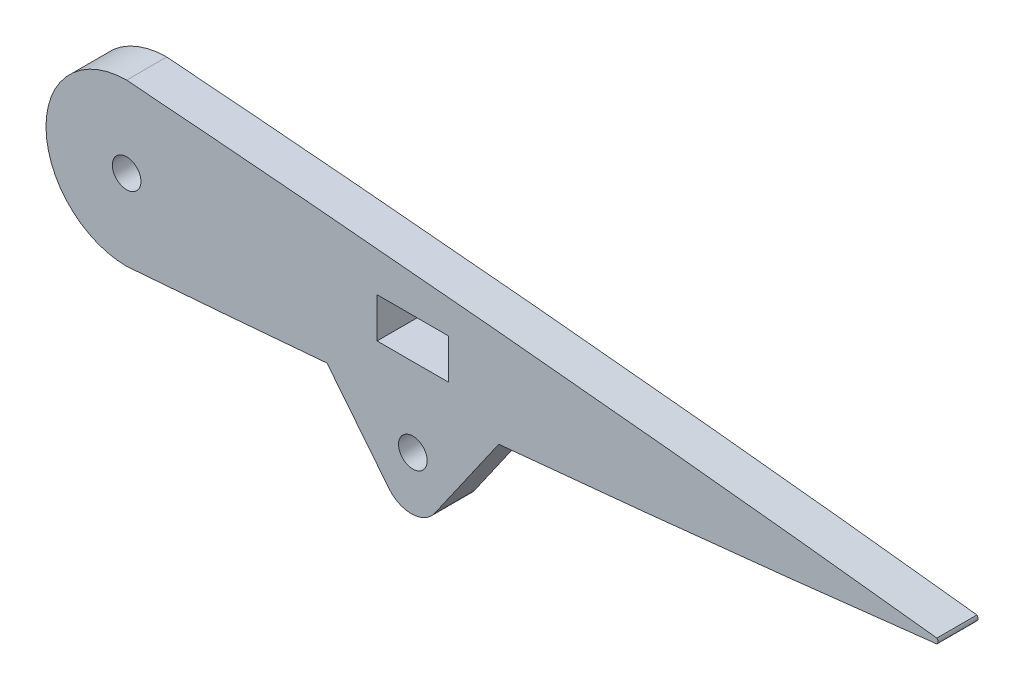
ISO-10303-21;
HEADER;
FILE_DESCRIPTION(('STEP AP214'),'2;1');
FILE_NAME('part.step','',(''),(''),'','','');
FILE_SCHEMA(('AUTOMOTIVE_DESIGN { 1 0 10303 214 1 1 1 1 }'));
ENDSEC;
DATA;
#1=APPLICATION_CONTEXT('core data for automotive mechanical design processes');
#2=APPLICATION_PROTOCOL_DEFINITION('international standard','automotive_design',2000,#1);
#3=PRODUCT_CONTEXT('',#1,'mechanical');
#4=PRODUCT('Part','Part','',(#3));
#5=PRODUCT_RELATED_PRODUCT_CATEGORY('part','',(#4));
#6=PRODUCT_DEFINITION_FORMATION('','',#4);
#7=PRODUCT_DEFINITION_CONTEXT('part definition',#1,'design');
#8=PRODUCT_DEFINITION('design','',#6,#7);
#9=PRODUCT_DEFINITION_SHAPE('','',#8);
#10=(LENGTH_UNIT() NAMED_UNIT(*) SI_UNIT(.MILLI.,.METRE.));
#11=(NAMED_UNIT(*) PLANE_ANGLE_UNIT() SI_UNIT($,.RADIAN.));
#12=(NAMED_UNIT(*) SI_UNIT($,.STERADIAN.) SOLID_ANGLE_UNIT());
#13=UNCERTAINTY_MEASURE_WITH_UNIT(LENGTH_MEASURE(1.E-05),#10,'distance_accuracy_value','');
#14=(GEOMETRIC_REPRESENTATION_CONTEXT(3) GLOBAL_UNCERTAINTY_ASSIGNED_CONTEXT((#13)) GLOBAL_UNIT_ASSIGNED_CONTEXT((#10,
#11,#12)) REPRESENTATION_CONTEXT('',''));
#15=CARTESIAN_POINT('',(0.,0.,0.));
#16=DIRECTION('',(0.,0.,1.));
#17=DIRECTION('',(1.,0.,0.));
#18=AXIS2_PLACEMENT_3D('',#15,#16,#17);
#19=CARTESIAN_POINT('',(169.330721683866,-118.139476491506,1.4));
#20=DIRECTION('',(-0.820122945797254,0.572187341503492,0.));
#21=DIRECTION('',(-0.572187341503492,-0.820122945797254,0.));
#22=AXIS2_PLACEMENT_3D('',#19,#20,#21);
#23=PLANE('',#22);
#24=DIRECTION('',(0.572187341503492,0.820122945797254,0.));
#25=VECTOR('',#24,1.);
#26=CARTESIAN_POINT('',(169.330721683866,-118.139476491506,-1.4));
#27=LINE('',#26,#25);
#28=CARTESIAN_POINT('',(244.914699501068,-9.80405896962212,-1.4));
#29=VERTEX_POINT('',#28);
#30=CARTESIAN_POINT('',(249.382624747265,-3.40012838827625,-1.4));
#31=VERTEX_POINT('',#30);
#32=EDGE_CURVE('E179',#29,#31,#27,.T.);
#33=ORIENTED_EDGE('',*,*,#32,.T.);
#34=DIRECTION('',(0.,0.,-1.));
#35=VECTOR('',#34,1.);
#36=CARTESIAN_POINT('',(249.382624747265,-3.40012838827625,1.4));
#37=LINE('',#36,#35);
#38=CARTESIAN_POINT('',(249.382624747265,-3.40012838827625,1.4));
#39=VERTEX_POINT('',#38);
#40=EDGE_CURVE('E11',#39,#31,#37,.T.);
#41=ORIENTED_EDGE('',*,*,#40,.F.);
#42=DIRECTION('',(0.572187341503492,0.820122945797254,0.));
#43=VECTOR('',#42,1.);
#44=CARTESIAN_POINT('',(169.330721683866,-118.139476491506,1.4));
#45=LINE('',#44,#43);
#46=CARTESIAN_POINT('',(244.914699501068,-9.80405896962212,1.4));
#47=VERTEX_POINT('',#46);
#48=EDGE_CURVE('E257',#47,#39,#45,.T.);
#49=ORIENTED_EDGE('',*,*,#48,.F.);
#50=DIRECTION('',(0.,0.,-1.));
#51=VECTOR('',#50,1.);
#52=CARTESIAN_POINT('',(244.914699501068,-9.80405896962212,1.4));
#53=LINE('',#52,#51);
#54=EDGE_CURVE('E211',#47,#29,#53,.T.);
#55=ORIENTED_EDGE('',*,*,#54,.T.);
#56=EDGE_LOOP('',(#33,#41,#49,#55));
#57=FACE_BOUND('',#56,.T.);
#58=ADVANCED_FACE('F35',(#57),#23,.F.);
#59=CARTESIAN_POINT('',(249.382624747265,-3.40012838827632,1.4));
#60=CARTESIAN_POINT('',(251.158571989076,-3.23227422422827,1.4));
#61=CARTESIAN_POINT('',(254.371192488481,-2.92300016112608,1.4));
#62=CARTESIAN_POINT('',(258.952644661841,-2.46718813767968,1.4));
#63=CARTESIAN_POINT('',(263.04774337821,-2.04785660382374,1.4));
#64=CARTESIAN_POINT('',(266.898988861822,-1.64260730408502,1.4));
#65=CARTESIAN_POINT('',(270.455833183166,-1.25859090465163,1.4));
#66=CARTESIAN_POINT('',(273.651166983566,-0.905304265448741,1.4));
#67=CARTESIAN_POINT('',(276.385426802208,-0.596436481930152,1.4));
#68=CARTESIAN_POINT('',(278.452596210233,-0.358958360841393,1.4));
#69=CARTESIAN_POINT('',(279.592043703671,-0.226075897782657,1.4));
#70=CARTESIAN_POINT('',(280.,-0.1785,1.4));
#71=B_SPLINE_CURVE_WITH_KNOTS('',3,(#59,#60,#61,#62,#63,#64,#65,#66,#67,#68,#69,#70),
.UNSPECIFIED.,.F.,.F.,(4,1,1,1,1,1,1,1,1,4),(0.821480843588143,0.852512114582347,
0.877624445997917,0.901571133904992,0.924121062493777,0.944988816236938,0.963803938777258,
0.980044339265455,0.992855276358985,1.),.UNSPECIFIED.);
#72=DIRECTION('',(0.,0.,-1.));
#73=VECTOR('',#72,1.);
#74=SURFACE_OF_LINEAR_EXTRUSION('',#71,#73);
#75=CARTESIAN_POINT('',(249.382624747265,-3.40012838827632,-1.4));
#76=CARTESIAN_POINT('',(251.158571989076,-3.23227422422827,-1.4));
#77=CARTESIAN_POINT('',(254.371192488481,-2.92300016112608,-1.4));
#78=CARTESIAN_POINT('',(258.952644661841,-2.46718813767968,-1.4));
#79=CARTESIAN_POINT('',(263.04774337821,-2.04785660382374,-1.4));
#80=CARTESIAN_POINT('',(266.898988861822,-1.64260730408502,-1.4));
#81=CARTESIAN_POINT('',(270.455833183166,-1.25859090465163,-1.4));
#82=CARTESIAN_POINT('',(273.651166983566,-0.905304265448741,-1.4));
#83=CARTESIAN_POINT('',(276.385426802208,-0.596436481930152,-1.4));
#84=CARTESIAN_POINT('',(278.452596210233,-0.358958360841393,-1.4));
#85=CARTESIAN_POINT('',(279.592043703671,-0.226075897782657,-1.4));
#86=CARTESIAN_POINT('',(280.,-0.1785,-1.4));
#87=B_SPLINE_CURVE_WITH_KNOTS('',3,(#75,#76,#77,#78,#79,#80,#81,#82,#83,#84,#85,#86),
.UNSPECIFIED.,.F.,.F.,(4,1,1,1,1,1,1,1,1,4),(0.821480843588143,0.852512114582347,
0.877624445997917,0.901571133904992,0.924121062493777,0.944988816236938,0.963803938777258,
0.980044339265455,0.992855276358985,1.),.UNSPECIFIED.);
#88=CARTESIAN_POINT('',(280.,-0.1785,-1.4));
#89=VERTEX_POINT('',#88);
#90=EDGE_CURVE('E182',#31,#89,#87,.T.);
#91=ORIENTED_EDGE('',*,*,#90,.T.);
#92=DIRECTION('',(0.,0.,-1.));
#93=VECTOR('',#92,1.);
#94=CARTESIAN_POINT('',(280.,-0.1785,1.4));
#95=LINE('',#94,#93);
#96=CARTESIAN_POINT('',(280.,-0.1785,1.4));
#97=VERTEX_POINT('',#96);
#98=EDGE_CURVE('E45',#97,#89,#95,.T.);
#99=ORIENTED_EDGE('',*,*,#98,.F.);
#100=EDGE_CURVE('E259',#39,#97,#71,.T.);
#101=ORIENTED_EDGE('',*,*,#100,.F.);
#102=ORIENTED_EDGE('',*,*,#40,.T.);
#103=EDGE_LOOP('',(#91,#99,#101,#102));
#104=FACE_BOUND('',#103,.T.);
#105=ADVANCED_FACE('F270',(#104),#74,.F.);
#106=CARTESIAN_POINT('',(279.8215,0.,1.4));
#107=DIRECTION('',(0.,0.,-1.));
#108=DIRECTION('',(-1.,0.,0.));
#109=AXIS2_PLACEMENT_3D('',#106,#107,#108);
#110=CYLINDRICAL_SURFACE('',#109,0.252437120883675);
#111=CARTESIAN_POINT('',(279.8215,0.,-1.4));
#112=DIRECTION('',(0.,0.,1.));
#113=DIRECTION('',(1.,0.,0.));
#114=AXIS2_PLACEMENT_3D('',#111,#112,#113);
#115=CIRCLE('',#114,0.252437120883675);
#116=CARTESIAN_POINT('',(280.,0.1785,-1.4));
#117=VERTEX_POINT('',#116);
#118=EDGE_CURVE('E187',#117,#89,#115,.F.);
#119=ORIENTED_EDGE('',*,*,#118,.F.);
#120=DIRECTION('',(0.,0.,-1.));
#121=VECTOR('',#120,1.);
#122=CARTESIAN_POINT('',(280.,0.1785,1.4));
#123=LINE('',#122,#121);
#124=CARTESIAN_POINT('',(280.,0.1785,1.4));
#125=VERTEX_POINT('',#124);
#126=EDGE_CURVE('E218',#125,#117,#123,.T.);
#127=ORIENTED_EDGE('',*,*,#126,.F.);
#128=CARTESIAN_POINT('',(279.8215,0.,1.4));
#129=DIRECTION('',(0.,0.,1.));
#130=DIRECTION('',(1.,0.,0.));
#131=AXIS2_PLACEMENT_3D('',#128,#129,#130);
#132=CIRCLE('',#131,0.252437120883675);
#133=EDGE_CURVE('E264',#125,#97,#132,.F.);
#134=ORIENTED_EDGE('',*,*,#133,.T.);
#135=ORIENTED_EDGE('',*,*,#98,.T.);
#136=EDGE_LOOP('',(#119,#127,#134,#135));
#137=FACE_BOUND('',#136,.T.);
#138=ADVANCED_FACE('F274',(#137),#110,.T.);
#139=CARTESIAN_POINT('',(280.,0.1785,1.4));
#140=CARTESIAN_POINT('',(279.592043703671,0.226075897783467,1.4));
#141=CARTESIAN_POINT('',(278.452596210234,0.358958360844463,1.4));
#142=CARTESIAN_POINT('',(276.385426802208,0.596436481937331,1.4));
#143=CARTESIAN_POINT('',(273.651166983567,0.905304265461348,1.4));
#144=CARTESIAN_POINT('',(270.455833183168,1.25859090467058,1.4));
#145=CARTESIAN_POINT('',(266.898988861825,1.64260730411104,1.4));
#146=CARTESIAN_POINT('',(263.047743378214,2.04785660385741,1.4));
#147=CARTESIAN_POINT('',(258.952644661846,2.46718813772148,1.4));
#148=CARTESIAN_POINT('',(253.11611192075,3.04786904369115,1.4));
#149=CARTESIAN_POINT('',(247.071089235748,3.62220530992837,1.4));
#150=CARTESIAN_POINT('',(240.854179313273,4.18491264898859,1.4));
#151=CARTESIAN_POINT('',(236.038226964104,4.60581174883637,1.4));
#152=CARTESIAN_POINT('',(231.150377302514,5.0173511026198,1.4));
#153=CARTESIAN_POINT('',(226.209311113549,5.41695826474113,1.4));
#154=CARTESIAN_POINT('',(221.232257466585,5.802244474926,1.4));
#155=CARTESIAN_POINT('',(216.235178286272,6.17086457697306,1.4));
#156=CARTESIAN_POINT('',(211.232977593233,6.52047434958791,1.4));
#157=CARTESIAN_POINT('',(206.239642946259,6.84887299963153,1.4));
#158=CARTESIAN_POINT('',(201.268368916985,7.15382688632495,1.4));
#159=CARTESIAN_POINT('',(196.331634567492,7.43310533690328,1.4));
#160=CARTESIAN_POINT('',(191.441311474098,7.68460443906704,1.4));
#161=CARTESIAN_POINT('',(186.608700126931,7.90621829286941,1.4));
#162=CARTESIAN_POINT('',(181.844626933159,8.09595849303594,1.4));
#163=CARTESIAN_POINT('',(177.159453511195,8.25195768192942,1.4));
#164=CARTESIAN_POINT('',(172.563150271755,8.37248656398387,1.4));
#165=CARTESIAN_POINT('',(168.065295924147,8.45595366245417,1.4));
#166=CARTESIAN_POINT('',(163.675147454163,8.5010026998616,1.4));
#167=CARTESIAN_POINT('',(159.401643403725,8.50652296727326,1.4));
#168=CARTESIAN_POINT('',(155.253439755899,8.47152880790102,1.4));
#169=CARTESIAN_POINT('',(151.238917925322,8.39550607585732,1.4));
#170=CARTESIAN_POINT('',(147.366223919106,8.27798597685019,1.4));
#171=CARTESIAN_POINT('',(143.643266298458,8.11897556141504,1.4));
#172=CARTESIAN_POINT('',(140.077743555427,7.91867894287145,1.4));
#173=CARTESIAN_POINT('',(136.677139412155,7.67760454203032,1.4));
#174=CARTESIAN_POINT('',(133.44876289533,7.39648056861162,1.4));
#175=CARTESIAN_POINT('',(130.399721685833,7.07642431038863,1.4));
#176=CARTESIAN_POINT('',(127.536961088608,6.71865034112428,1.4));
#177=CARTESIAN_POINT('',(124.867245825052,6.32466607739586,1.4));
#178=CARTESIAN_POINT('',(122.397158973637,5.89612056643678,1.4));
#179=CARTESIAN_POINT('',(120.133109351335,5.43479747619412,1.4));
#180=CARTESIAN_POINT('',(118.081312132678,4.94256764101073,1.4));
#181=CARTESIAN_POINT('',(116.247665797811,4.42139238611828,1.4));
#182=CARTESIAN_POINT('',(114.637939719778,3.87306046577258,1.4));
#183=CARTESIAN_POINT('',(113.256788366372,3.29930923783808,1.4));
#184=CARTESIAN_POINT('',(112.109835923497,2.70130638754162,1.4));
#185=CARTESIAN_POINT('',(111.196336340545,2.07855523302877,1.4));
#186=CARTESIAN_POINT('',(110.530223641577,1.42706975809109,1.4));
#187=CARTESIAN_POINT('',(110.085538217979,0.734230220465984,1.4));
#188=CARTESIAN_POINT('',(110.027578175867,0.236721440142773,1.4));
#189=CARTESIAN_POINT('',(110.,0.,1.4));
#190=B_SPLINE_CURVE_WITH_KNOTS('',3,(#139,#140,#141,#142,#143,#144,#145,#146,#147,#148,#149,
#150,#151,#152,#153,#154,#155,#156,#157,#158,#159,#160,#161,#162,#163,#164,#165,#166,#167,#168,
#169,#170,#171,#172,#173,#174,#175,#176,#177,#178,#179,#180,#181,#182,#183,#184,#185,#186,#187,
#188,#189),.UNSPECIFIED.,.F.,.F.,(4,1,1,1,1,1,1,1,1,1,1,1,1,1,1,1,1,1,1,1,1,1,1,1,1,1,1,1,1,1,1,
1,1,1,1,1,1,1,1,1,1,1,1,1,1,1,1,1,4),(0.,0.00714472364101537,0.0199556607345446,
0.0361960612227423,0.0550111837630616,0.0758789375062231,0.0984288660950085,0.122375554002083,
0.147487885417653,0.200459747132314,0.228005170188377,0.256076453638138,0.284555151070125,
0.31333276259982,0.342309553949656,0.371392651251454,0.400495752426115,0.429537687145242,
0.458441905920554,0.487136113386761,0.515551917136779,0.543623846405843,0.571289984327897,
0.598490809568145,0.625169613225281,0.651272029103837,0.676746157949116,0.701541790883913,
0.725611016556625,0.74890783507394,0.771387785068823,0.793008138575143,0.813728032856974,
0.833507815357633,0.852309696093785,0.870097310144046,0.886835918069106,0.902492781713446,
0.917037139140432,0.930441053860646,0.942679762162792,0.953733567025024,0.963589785484808,
0.97224701929817,0.979722225388436,0.986065145275041,0.991385258303778,0.995900988803729,1.),.UNSPECIFIED.);
#191=DIRECTION('',(0.,0.,-1.));
#192=VECTOR('',#191,1.);
#193=SURFACE_OF_LINEAR_EXTRUSION('',#190,#192);
#194=CARTESIAN_POINT('',(280.,0.1785,-1.4));
#195=CARTESIAN_POINT('',(279.592043703671,0.226075897783467,-1.4));
#196=CARTESIAN_POINT('',(278.452596210234,0.358958360844463,-1.4));
#197=CARTESIAN_POINT('',(276.385426802208,0.596436481937331,-1.4));
#198=CARTESIAN_POINT('',(273.651166983567,0.905304265461348,-1.4));
#199=CARTESIAN_POINT('',(270.455833183168,1.25859090467058,-1.4));
#200=CARTESIAN_POINT('',(266.898988861825,1.64260730411104,-1.4));
#201=CARTESIAN_POINT('',(263.047743378214,2.04785660385741,-1.4));
#202=CARTESIAN_POINT('',(258.952644661846,2.46718813772148,-1.4));
#203=CARTESIAN_POINT('',(253.11611192075,3.04786904369115,-1.4));
#204=CARTESIAN_POINT('',(247.071089235748,3.62220530992837,-1.4));
#205=CARTESIAN_POINT('',(240.854179313273,4.18491264898859,-1.4));
#206=CARTESIAN_POINT('',(236.038226964104,4.60581174883637,-1.4));
#207=CARTESIAN_POINT('',(231.150377302514,5.0173511026198,-1.4));
#208=CARTESIAN_POINT('',(226.209311113549,5.41695826474113,-1.4));
#209=CARTESIAN_POINT('',(221.232257466585,5.802244474926,-1.4));
#210=CARTESIAN_POINT('',(216.235178286272,6.17086457697306,-1.4));
#211=CARTESIAN_POINT('',(211.232977593233,6.52047434958791,-1.4));
#212=CARTESIAN_POINT('',(206.239642946259,6.84887299963153,-1.4));
#213=CARTESIAN_POINT('',(201.268368916985,7.15382688632495,-1.4));
#214=CARTESIAN_POINT('',(196.331634567492,7.43310533690328,-1.4));
#215=CARTESIAN_POINT('',(191.441311474098,7.68460443906704,-1.4));
#216=CARTESIAN_POINT('',(186.608700126931,7.90621829286941,-1.4));
#217=CARTESIAN_POINT('',(181.844626933159,8.09595849303594,-1.4));
#218=CARTESIAN_POINT('',(177.159453511195,8.25195768192942,-1.4));
#219=CARTESIAN_POINT('',(172.563150271755,8.37248656398387,-1.4));
#220=CARTESIAN_POINT('',(168.065295924147,8.45595366245417,-1.4));
#221=CARTESIAN_POINT('',(163.675147454163,8.5010026998616,-1.4));
#222=CARTESIAN_POINT('',(159.401643403725,8.50652296727326,-1.4));
#223=CARTESIAN_POINT('',(155.253439755899,8.47152880790102,-1.4));
#224=CARTESIAN_POINT('',(151.238917925322,8.39550607585732,-1.4));
#225=CARTESIAN_POINT('',(147.366223919106,8.27798597685019,-1.4));
#226=CARTESIAN_POINT('',(143.643266298458,8.11897556141504,-1.4));
#227=CARTESIAN_POINT('',(140.077743555427,7.91867894287145,-1.4));
#228=CARTESIAN_POINT('',(136.677139412155,7.67760454203032,-1.4));
#229=CARTESIAN_POINT('',(133.44876289533,7.39648056861162,-1.4));
#230=CARTESIAN_POINT('',(130.399721685833,7.07642431038863,-1.4));
#231=CARTESIAN_POINT('',(127.536961088608,6.71865034112428,-1.4));
#232=CARTESIAN_POINT('',(124.867245825052,6.32466607739586,-1.4));
#233=CARTESIAN_POINT('',(122.397158973637,5.89612056643678,-1.4));
#234=CARTESIAN_POINT('',(120.133109351335,5.43479747619412,-1.4));
#235=CARTESIAN_POINT('',(118.081312132678,4.94256764101073,-1.4));
#236=CARTESIAN_POINT('',(116.247665797811,4.42139238611828,-1.4));
#237=CARTESIAN_POINT('',(114.637939719778,3.87306046577258,-1.4));
#238=CARTESIAN_POINT('',(113.256788366372,3.29930923783808,-1.4));
#239=CARTESIAN_POINT('',(112.109835923497,2.70130638754162,-1.4));
#240=CARTESIAN_POINT('',(111.196336340545,2.07855523302877,-1.4));
#241=CARTESIAN_POINT('',(110.530223641577,1.42706975809109,-1.4));
#242=CARTESIAN_POINT('',(110.085538217979,0.734230220465984,-1.4));
#243=CARTESIAN_POINT('',(110.027578175867,0.236721440142773,-1.4));
#244=CARTESIAN_POINT('',(110.,0.,-1.4));
#245=B_SPLINE_CURVE_WITH_KNOTS('',3,(#194,#195,#196,#197,#198,#199,#200,#201,#202,#203,#204,
#205,#206,#207,#208,#209,#210,#211,#212,#213,#214,#215,#216,#217,#218,#219,#220,#221,#222,#223,
#224,#225,#226,#227,#228,#229,#230,#231,#232,#233,#234,#235,#236,#237,#238,#239,#240,#241,#242,
#243,#244),.UNSPECIFIED.,.F.,.F.,(4,1,1,1,1,1,1,1,1,1,1,1,1,1,1,1,1,1,1,1,1,1,1,1,1,1,1,1,1,1,1,
1,1,1,1,1,1,1,1,1,1,1,1,1,1,1,1,1,4),(0.,0.00714472364101537,0.0199556607345446,
0.0361960612227423,0.0550111837630616,0.0758789375062231,0.0984288660950085,0.122375554002083,
0.147487885417653,0.200459747132314,0.228005170188377,0.256076453638138,0.284555151070125,
0.31333276259982,0.342309553949656,0.371392651251454,0.400495752426115,0.429537687145242,
0.458441905920554,0.487136113386761,0.515551917136779,0.543623846405843,0.571289984327897,
0.598490809568145,0.625169613225281,0.651272029103837,0.676746157949116,0.701541790883913,
0.725611016556625,0.74890783507394,0.771387785068823,0.793008138575143,0.813728032856974,
0.833507815357633,0.852309696093785,0.870097310144046,0.886835918069106,0.902492781713446,
0.917037139140432,0.930441053860646,0.942679762162792,0.953733567025024,0.963589785484808,
0.97224701929817,0.979722225388436,0.986065145275041,0.991385258303778,0.995900988803729,1.),.UNSPECIFIED.);
#246=CARTESIAN_POINT('',(223.382624747256,5.63499062833055,-1.4));
#247=VERTEX_POINT('',#246);
#248=EDGE_CURVE('E193',#117,#247,#245,.T.);
#249=ORIENTED_EDGE('',*,*,#248,.T.);
#250=DIRECTION('',(0.,0.,-1.));
#251=VECTOR('',#250,1.);
#252=CARTESIAN_POINT('',(223.382624747256,5.63499062833055,1.4));
#253=LINE('',#252,#251);
#254=CARTESIAN_POINT('',(223.382624747256,5.63499062833055,1.4));
#255=VERTEX_POINT('',#254);
#256=EDGE_CURVE('E215',#255,#247,#253,.T.);
#257=ORIENTED_EDGE('',*,*,#256,.F.);
#258=EDGE_CURVE('E313',#125,#255,#190,.T.);
#259=ORIENTED_EDGE('',*,*,#258,.F.);
#260=ORIENTED_EDGE('',*,*,#126,.T.);
#261=EDGE_LOOP('',(#249,#257,#259,#260));
#262=FACE_BOUND('',#261,.T.);
#263=ADVANCED_FACE('F309',(#262),#193,.F.);
#264=CARTESIAN_POINT('',(223.382624747265,3.73832909072992E-12,1.4));
#265=DIRECTION('',(0.,0.,-1.));
#266=DIRECTION('',(-1.,0.,0.));
#267=AXIS2_PLACEMENT_3D('',#264,#265,#266);
#268=CYLINDRICAL_SURFACE('',#267,5.63499062832681);
#269=CARTESIAN_POINT('',(223.382624747265,3.73832909072992E-12,-1.4));
#270=DIRECTION('',(0.,0.,1.));
#271=DIRECTION('',(1.,0.,0.));
#272=AXIS2_PLACEMENT_3D('',#269,#270,#271);
#273=CIRCLE('',#272,5.63499062832681);
#274=CARTESIAN_POINT('',(223.382624747256,-5.63499062832307,-1.4));
#275=VERTEX_POINT('',#274);
#276=EDGE_CURVE('E197',#247,#275,#273,.T.);
#277=ORIENTED_EDGE('',*,*,#276,.T.);
#278=DIRECTION('',(0.,0.,-1.));
#279=VECTOR('',#278,1.);
#280=CARTESIAN_POINT('',(223.382624747256,-5.63499062832307,1.4));
#281=LINE('',#280,#279);
#282=CARTESIAN_POINT('',(223.382624747256,-5.63499062832307,1.4));
#283=VERTEX_POINT('',#282);
#284=EDGE_CURVE('E150',#283,#275,#281,.T.);
#285=ORIENTED_EDGE('',*,*,#284,.F.);
#286=CARTESIAN_POINT('',(223.382624747265,3.73832909072992E-12,1.4));
#287=DIRECTION('',(0.,0.,1.));
#288=DIRECTION('',(1.,0.,0.));
#289=AXIS2_PLACEMENT_3D('',#286,#287,#288);
#290=CIRCLE('',#289,5.63499062832681);
#291=EDGE_CURVE('E141',#255,#283,#290,.T.);
#292=ORIENTED_EDGE('',*,*,#291,.F.);
#293=ORIENTED_EDGE('',*,*,#256,.T.);
#294=EDGE_LOOP('',(#277,#285,#292,#293));
#295=FACE_BOUND('',#294,.T.);
#296=ADVANCED_FACE('F303',(#295),#268,.T.);
#297=CARTESIAN_POINT('',(110.,0.,1.4));
#298=CARTESIAN_POINT('',(110.0275781759,-0.23672144013897,1.4));
#299=CARTESIAN_POINT('',(110.08553821808,-0.734230220454186,1.4));
#300=CARTESIAN_POINT('',(110.530223641774,-1.42706975801802,1.4));
#301=CARTESIAN_POINT('',(111.196336340831,-2.07855523286391,1.4));
#302=CARTESIAN_POINT('',(112.109835923869,-2.70130638725085,1.4));
#303=CARTESIAN_POINT('',(113.256788366826,-3.29930923738926,1.4));
#304=CARTESIAN_POINT('',(114.637939720312,-3.87306046513341,1.4));
#305=CARTESIAN_POINT('',(116.24766579842,-4.42139238525728,1.4));
#306=CARTESIAN_POINT('',(118.081312133359,-4.94256763989703,1.4));
#307=CARTESIAN_POINT('',(120.133109352084,-5.43479747479766,1.4));
#308=CARTESIAN_POINT('',(122.39715897445,-5.8961205647283,1.4));
#309=CARTESIAN_POINT('',(124.867245825924,-6.32466607534698,1.4));
#310=CARTESIAN_POINT('',(127.536961089533,-6.71865033870748,1.4));
#311=CARTESIAN_POINT('',(130.399721686808,-7.07642430757731,1.4));
#312=CARTESIAN_POINT('',(133.44876289635,-7.3964805653801,1.4));
#313=CARTESIAN_POINT('',(136.677139413213,-7.6776045383539,1.4));
#314=CARTESIAN_POINT('',(140.077743556518,-7.91867893872639,1.4));
#315=CARTESIAN_POINT('',(143.643266299577,-8.1189755567786,1.4));
#316=CARTESIAN_POINT('',(147.366223920246,-8.27798597170068,1.4));
#317=CARTESIAN_POINT('',(151.238917926479,-8.39550607017411,1.4));
#318=CARTESIAN_POINT('',(155.253439757066,-8.47152880166456,1.4));
#319=CARTESIAN_POINT('',(159.401643404897,-8.50652296046512,1.4));
#320=CARTESIAN_POINT('',(163.675147455335,-8.50100269246453,1.4));
#321=CARTESIAN_POINT('',(168.065295925312,-8.45595365445208,1.4));
#322=CARTESIAN_POINT('',(172.563150272909,-8.37248655536192,1.4));
#323=CARTESIAN_POINT('',(177.159453512332,-8.25195767267405,1.4));
#324=CARTESIAN_POINT('',(181.844626934275,-8.0959584831349,1.4));
#325=CARTESIAN_POINT('',(186.60870012802,-7.90621828231182,1.4));
#326=CARTESIAN_POINT('',(191.441311475157,-7.68460442784347,1.4));
#327=CARTESIAN_POINT('',(196.331634568517,-7.43310532500576,1.4));
#328=CARTESIAN_POINT('',(201.268368917971,-7.15382687374709,1.4));
#329=CARTESIAN_POINT('',(206.239642947203,-6.84887298636857,1.4));
#330=CARTESIAN_POINT('',(211.232977594131,-6.52047433563681,1.4));
#331=CARTESIAN_POINT('',(216.235178287122,-6.17086456233259,1.4));
#332=CARTESIAN_POINT('',(221.232257467384,-5.80224445959688,1.4));
#333=CARTESIAN_POINT('',(226.209311114295,-5.41695824872611,1.4));
#334=CARTESIAN_POINT('',(231.150377303206,-5.01735108592385,1.4));
#335=CARTESIAN_POINT('',(234.870714804015,-4.70411205455705,1.4));
#336=CARTESIAN_POINT('',(236.942213239561,-4.52545946281774,1.4));
#337=CARTESIAN_POINT('',(237.382624747265,-4.48728584819188,1.4));
#338=B_SPLINE_CURVE_WITH_KNOTS('',3,(#297,#298,#299,#300,#301,#302,#303,#304,#305,#306,#307,
#308,#309,#310,#311,#312,#313,#314,#315,#316,#317,#318,#319,#320,#321,#322,#323,#324,#325,#326,
#327,#328,#329,#330,#331,#332,#333,#334,#335,#336,#337),.UNSPECIFIED.,.F.,.F.,(4,1,1,1,1,1,1,1,
1,1,1,1,1,1,1,1,1,1,1,1,1,1,1,1,1,1,1,1,1,1,1,1,1,1,1,1,1,1,4),(0.,0.00409901119627066,
0.00861474169622249,0.013934854724959,0.0202777746115639,0.0277529807018305,0.0364102145151919,
0.0462664329749759,0.057320237837208,0.0695589461393541,0.0829628608595683,0.0975072182865541,
0.113164081930894,0.129902689855954,0.147690303906216,0.166492184642367,0.186271967143026,
0.206991861424858,0.228612214931177,0.25109216492606,0.274388983443375,0.298458209116087,
0.323253842050884,0.348727970896163,0.374830386774719,0.401509190431855,0.428710015672103,
0.456376153594157,0.484448082863221,0.512863886613239,0.541558094079446,0.570462312854758,
0.599504247573885,0.628607348748546,0.657690446050344,0.68666723740018,0.715444848929875,
0.743923546361862,0.751613474270005),.UNSPECIFIED.);
#339=DIRECTION('',(0.,0.,-1.));
#340=VECTOR('',#339,1.);
#341=SURFACE_OF_LINEAR_EXTRUSION('',#338,#340);
#342=CARTESIAN_POINT('',(110.,0.,-1.4));
#343=CARTESIAN_POINT('',(110.0275781759,-0.23672144013897,-1.4));
#344=CARTESIAN_POINT('',(110.08553821808,-0.734230220454186,-1.4));
#345=CARTESIAN_POINT('',(110.530223641774,-1.42706975801802,-1.4));
#346=CARTESIAN_POINT('',(111.196336340831,-2.07855523286391,-1.4));
#347=CARTESIAN_POINT('',(112.109835923869,-2.70130638725085,-1.4));
#348=CARTESIAN_POINT('',(113.256788366826,-3.29930923738926,-1.4));
#349=CARTESIAN_POINT('',(114.637939720312,-3.87306046513341,-1.4));
#350=CARTESIAN_POINT('',(116.24766579842,-4.42139238525728,-1.4));
#351=CARTESIAN_POINT('',(118.081312133359,-4.94256763989703,-1.4));
#352=CARTESIAN_POINT('',(120.133109352084,-5.43479747479766,-1.4));
#353=CARTESIAN_POINT('',(122.39715897445,-5.8961205647283,-1.4));
#354=CARTESIAN_POINT('',(124.867245825924,-6.32466607534698,-1.4));
#355=CARTESIAN_POINT('',(127.536961089533,-6.71865033870748,-1.4));
#356=CARTESIAN_POINT('',(130.399721686808,-7.07642430757731,-1.4));
#357=CARTESIAN_POINT('',(133.44876289635,-7.3964805653801,-1.4));
#358=CARTESIAN_POINT('',(136.677139413213,-7.6776045383539,-1.4));
#359=CARTESIAN_POINT('',(140.077743556518,-7.91867893872639,-1.4));
#360=CARTESIAN_POINT('',(143.643266299577,-8.1189755567786,-1.4));
#361=CARTESIAN_POINT('',(147.366223920246,-8.27798597170068,-1.4));
#362=CARTESIAN_POINT('',(151.238917926479,-8.39550607017411,-1.4));
#363=CARTESIAN_POINT('',(155.253439757066,-8.47152880166456,-1.4));
#364=CARTESIAN_POINT('',(159.401643404897,-8.50652296046512,-1.4));
#365=CARTESIAN_POINT('',(163.675147455335,-8.50100269246453,-1.4));
#366=CARTESIAN_POINT('',(168.065295925312,-8.45595365445208,-1.4));
#367=CARTESIAN_POINT('',(172.563150272909,-8.37248655536192,-1.4));
#368=CARTESIAN_POINT('',(177.159453512332,-8.25195767267405,-1.4));
#369=CARTESIAN_POINT('',(181.844626934275,-8.0959584831349,-1.4));
#370=CARTESIAN_POINT('',(186.60870012802,-7.90621828231182,-1.4));
#371=CARTESIAN_POINT('',(191.441311475157,-7.68460442784347,-1.4));
#372=CARTESIAN_POINT('',(196.331634568517,-7.43310532500576,-1.4));
#373=CARTESIAN_POINT('',(201.268368917971,-7.15382687374709,-1.4));
#374=CARTESIAN_POINT('',(206.239642947203,-6.84887298636857,-1.4));
#375=CARTESIAN_POINT('',(211.232977594131,-6.52047433563681,-1.4));
#376=CARTESIAN_POINT('',(216.235178287122,-6.17086456233259,-1.4));
#377=CARTESIAN_POINT('',(221.232257467384,-5.80224445959688,-1.4));
#378=CARTESIAN_POINT('',(226.209311114295,-5.41695824872611,-1.4));
#379=CARTESIAN_POINT('',(231.150377303206,-5.01735108592385,-1.4));
#380=CARTESIAN_POINT('',(234.870714804015,-4.70411205455705,-1.4));
#381=CARTESIAN_POINT('',(236.942213239561,-4.52545946281774,-1.4));
#382=CARTESIAN_POINT('',(237.382624747265,-4.48728584819188,-1.4));
#383=B_SPLINE_CURVE_WITH_KNOTS('',3,(#342,#343,#344,#345,#346,#347,#348,#349,#350,#351,#352,
#353,#354,#355,#356,#357,#358,#359,#360,#361,#362,#363,#364,#365,#366,#367,#368,#369,#370,#371,
#372,#373,#374,#375,#376,#377,#378,#379,#380,#381,#382),.UNSPECIFIED.,.F.,.F.,(4,1,1,1,1,1,1,1,
1,1,1,1,1,1,1,1,1,1,1,1,1,1,1,1,1,1,1,1,1,1,1,1,1,1,1,1,1,1,4),(0.,0.00409901119627066,
0.00861474169622249,0.013934854724959,0.0202777746115639,0.0277529807018305,0.0364102145151919,
0.0462664329749759,0.057320237837208,0.0695589461393541,0.0829628608595683,0.0975072182865541,
0.113164081930894,0.129902689855954,0.147690303906216,0.166492184642367,0.186271967143026,
0.206991861424858,0.228612214931177,0.25109216492606,0.274388983443375,0.298458209116087,
0.323253842050884,0.348727970896163,0.374830386774719,0.401509190431855,0.428710015672103,
0.456376153594157,0.484448082863221,0.512863886613239,0.541558094079446,0.570462312854758,
0.599504247573885,0.628607348748546,0.657690446050344,0.68666723740018,0.715444848929875,
0.743923546361862,0.751613474270005),.UNSPECIFIED.);
#384=CARTESIAN_POINT('',(237.382624747265,-4.48728584819186,-1.4));
#385=VERTEX_POINT('',#384);
#386=EDGE_CURVE('E149',#275,#385,#383,.T.);
#387=ORIENTED_EDGE('',*,*,#386,.T.);
#388=DIRECTION('',(0.,0.,-1.));
#389=VECTOR('',#388,1.);
#390=CARTESIAN_POINT('',(237.382624747265,-4.48728584819186,1.4));
#391=LINE('',#390,#389);
#392=CARTESIAN_POINT('',(237.382624747265,-4.48728584819186,1.4));
#393=VERTEX_POINT('',#392);
#394=EDGE_CURVE('E146',#393,#385,#391,.T.);
#395=ORIENTED_EDGE('',*,*,#394,.F.);
#396=EDGE_CURVE('E135',#283,#393,#338,.T.);
#397=ORIENTED_EDGE('',*,*,#396,.F.);
#398=ORIENTED_EDGE('',*,*,#284,.T.);
#399=EDGE_LOOP('',(#387,#395,#397,#398));
#400=FACE_BOUND('',#399,.T.);
#401=ADVANCED_FACE('F147',(#400),#341,.F.);
#402=CARTESIAN_POINT('',(142.748678802525,114.005678308555,1.4));
#403=DIRECTION('',(0.781384592666943,0.62404977232807,0.));
#404=DIRECTION('',(-0.62404977232807,0.781384592666943,0.));
#405=AXIS2_PLACEMENT_3D('',#402,#403,#404);
#406=PLANE('',#405);
#407=DIRECTION('',(0.62404977232807,-0.781384592666943,0.));
#408=VECTOR('',#407,1.);
#409=CARTESIAN_POINT('',(142.748678802525,114.005678308555,-1.4));
#410=LINE('',#409,#408);
#411=CARTESIAN_POINT('',(241.711684424139,-9.90778383127126,-1.4));
#412=VERTEX_POINT('',#411);
#413=EDGE_CURVE('E95',#385,#412,#410,.T.);
#414=ORIENTED_EDGE('',*,*,#413,.T.);
#415=DIRECTION('',(0.,0.,-1.));
#416=VECTOR('',#415,1.);
#417=CARTESIAN_POINT('',(241.711684424139,-9.90778383127126,1.4));
#418=LINE('',#417,#416);
#419=CARTESIAN_POINT('',(241.711684424139,-9.90778383127126,1.4));
#420=VERTEX_POINT('',#419);
#421=EDGE_CURVE('E151',#420,#412,#418,.T.);
#422=ORIENTED_EDGE('',*,*,#421,.F.);
#423=DIRECTION('',(0.62404977232807,-0.781384592666943,0.));
#424=VECTOR('',#423,1.);
#425=CARTESIAN_POINT('',(142.748678802525,114.005678308555,1.4));
#426=LINE('',#425,#424);
#427=EDGE_CURVE('E139',#393,#420,#426,.T.);
#428=ORIENTED_EDGE('',*,*,#427,.F.);
#429=ORIENTED_EDGE('',*,*,#394,.T.);
#430=EDGE_LOOP('',(#414,#422,#428,#429));
#431=FACE_BOUND('',#430,.T.);
#432=ADVANCED_FACE('F153',(#431),#406,.F.);
#433=CARTESIAN_POINT('',(245.882624747265,0.,1.4));
#434=DIRECTION('',(-1.,0.,0.));
#435=DIRECTION('',(0.,0.,1.));
#436=AXIS2_PLACEMENT_3D('',#433,#434,#435);
#437=PLANE('',#436);
#438=DIRECTION('',(0.,1.,0.));
#439=VECTOR('',#438,1.);
#440=CARTESIAN_POINT('',(245.882624747265,0.,-1.4));
#441=LINE('',#440,#439);
#442=CARTESIAN_POINT('',(245.882624747265,-1.4,-1.4));
#443=VERTEX_POINT('',#442);
#444=CARTESIAN_POINT('',(245.882624747265,1.4,-1.4));
#445=VERTEX_POINT('',#444);
#446=EDGE_CURVE('E162',#443,#445,#441,.T.);
#447=ORIENTED_EDGE('',*,*,#446,.F.);
#448=DIRECTION('',(0.,0.,-1.));
#449=VECTOR('',#448,1.);
#450=CARTESIAN_POINT('',(245.882624747265,-1.4,1.4));
#451=LINE('',#450,#449);
#452=CARTESIAN_POINT('',(245.882624747265,-1.4,1.4));
#453=VERTEX_POINT('',#452);
#454=EDGE_CURVE('E39',#453,#443,#451,.T.);
#455=ORIENTED_EDGE('',*,*,#454,.F.);
#456=DIRECTION('',(0.,1.,0.));
#457=VECTOR('',#456,1.);
#458=CARTESIAN_POINT('',(245.882624747265,0.,1.4));
#459=LINE('',#458,#457);
#460=CARTESIAN_POINT('',(245.882624747265,1.4,1.4));
#461=VERTEX_POINT('',#460);
#462=EDGE_CURVE('E210',#453,#461,#459,.T.);
#463=ORIENTED_EDGE('',*,*,#462,.T.);
#464=DIRECTION('',(0.,0.,-1.));
#465=VECTOR('',#464,1.);
#466=CARTESIAN_POINT('',(245.882624747265,1.4,1.4));
#467=LINE('',#466,#465);
#468=EDGE_CURVE('E155',#461,#445,#467,.T.);
#469=ORIENTED_EDGE('',*,*,#468,.T.);
#470=EDGE_LOOP('',(#447,#455,#463,#469));
#471=FACE_BOUND('',#470,.T.);
#472=ADVANCED_FACE('F37',(#471),#437,.T.);
#473=CARTESIAN_POINT('',(0.,-1.4,1.4));
#474=DIRECTION('',(0.,1.,0.));
#475=DIRECTION('',(0.,0.,1.));
#476=AXIS2_PLACEMENT_3D('',#473,#474,#475);
#477=PLANE('',#476);
#478=DIRECTION('',(1.,0.,0.));
#479=VECTOR('',#478,1.);
#480=CARTESIAN_POINT('',(0.,-1.4,-1.4));
#481=LINE('',#480,#479);
#482=CARTESIAN_POINT('',(240.882624747265,-1.4,-1.4));
#483=VERTEX_POINT('',#482);
#484=EDGE_CURVE('E165',#483,#443,#481,.T.);
#485=ORIENTED_EDGE('',*,*,#484,.F.);
#486=DIRECTION('',(0.,0.,-1.));
#487=VECTOR('',#486,1.);
#488=CARTESIAN_POINT('',(240.882624747265,-1.4,1.4));
#489=LINE('',#488,#487);
#490=CARTESIAN_POINT('',(240.882624747265,-1.4,1.4));
#491=VERTEX_POINT('',#490);
#492=EDGE_CURVE('E224',#491,#483,#489,.T.);
#493=ORIENTED_EDGE('',*,*,#492,.F.);
#494=DIRECTION('',(1.,0.,0.));
#495=VECTOR('',#494,1.);
#496=CARTESIAN_POINT('',(0.,-1.4,1.4));
#497=LINE('',#496,#495);
#498=EDGE_CURVE('E233',#491,#453,#497,.T.);
#499=ORIENTED_EDGE('',*,*,#498,.T.);
#500=ORIENTED_EDGE('',*,*,#454,.T.);
#501=EDGE_LOOP('',(#485,#493,#499,#500));
#502=FACE_BOUND('',#501,.T.);
#503=ADVANCED_FACE('F231',(#502),#477,.T.);
#504=CARTESIAN_POINT('',(240.882624747265,0.,1.4));
#505=DIRECTION('',(-1.,0.,0.));
#506=DIRECTION('',(0.,0.,1.));
#507=AXIS2_PLACEMENT_3D('',#504,#505,#506);
#508=PLANE('',#507);
#509=DIRECTION('',(0.,1.,0.));
#510=VECTOR('',#509,1.);
#511=CARTESIAN_POINT('',(240.882624747265,0.,-1.4));
#512=LINE('',#511,#510);
#513=CARTESIAN_POINT('',(240.882624747265,1.4,-1.4));
#514=VERTEX_POINT('',#513);
#515=EDGE_CURVE('E168',#483,#514,#512,.T.);
#516=ORIENTED_EDGE('',*,*,#515,.T.);
#517=DIRECTION('',(0.,0.,-1.));
#518=VECTOR('',#517,1.);
#519=CARTESIAN_POINT('',(240.882624747265,1.4,1.4));
#520=LINE('',#519,#518);
#521=CARTESIAN_POINT('',(240.882624747265,1.4,1.4));
#522=VERTEX_POINT('',#521);
#523=EDGE_CURVE('E222',#522,#514,#520,.T.);
#524=ORIENTED_EDGE('',*,*,#523,.F.);
#525=DIRECTION('',(0.,1.,0.));
#526=VECTOR('',#525,1.);
#527=CARTESIAN_POINT('',(240.882624747265,0.,1.4));
#528=LINE('',#527,#526);
#529=EDGE_CURVE('E247',#491,#522,#528,.T.);
#530=ORIENTED_EDGE('',*,*,#529,.F.);
#531=ORIENTED_EDGE('',*,*,#492,.T.);
#532=EDGE_LOOP('',(#516,#524,#530,#531));
#533=FACE_BOUND('',#532,.T.);
#534=ADVANCED_FACE('F240',(#533),#508,.F.);
#535=CARTESIAN_POINT('',(243.382624747265,-6.90312559618914,1.4));
#536=DIRECTION('',(0.,0.,-1.));
#537=DIRECTION('',(-1.,0.,0.));
#538=AXIS2_PLACEMENT_3D('',#535,#536,#537);
#539=CYLINDRICAL_SURFACE('',#538,0.999999999999998);
#540=CARTESIAN_POINT('',(243.382624747265,-6.90312559618914,1.4));
#541=DIRECTION('',(0.,0.,1.));
#542=DIRECTION('',(1.,0.,0.));
#543=AXIS2_PLACEMENT_3D('',#540,#541,#542);
#544=CIRCLE('',#543,0.999999999999998);
#545=CARTESIAN_POINT('',(244.382624747265,-6.90312559618914,1.4));
#546=VERTEX_POINT('',#545);
#547=EDGE_CURVE('E250',#546,#546,#544,.T.);
#548=ORIENTED_EDGE('',*,*,#547,.T.);
#549=EDGE_LOOP('',(#548));
#550=FACE_BOUND('',#549,.T.);
#551=CARTESIAN_POINT('',(243.382624747265,-6.90312559618914,-1.4));
#552=DIRECTION('',(0.,0.,1.));
#553=DIRECTION('',(1.,0.,0.));
#554=AXIS2_PLACEMENT_3D('',#551,#552,#553);
#555=CIRCLE('',#554,0.999999999999998);
#556=CARTESIAN_POINT('',(244.382624747265,-6.90312559618914,-1.4));
#557=VERTEX_POINT('',#556);
#558=EDGE_CURVE('E176',#557,#557,#555,.T.);
#559=ORIENTED_EDGE('',*,*,#558,.F.);
#560=EDGE_LOOP('',(#559));
#561=FACE_BOUND('',#560,.T.);
#562=ADVANCED_FACE('F280',(#550,#561),#539,.F.);
#563=CARTESIAN_POINT('',(223.382624747265,3.73832909072992E-12,1.4));
#564=DIRECTION('',(0.,0.,-1.));
#565=DIRECTION('',(-1.,0.,0.));
#566=AXIS2_PLACEMENT_3D('',#563,#564,#565);
#567=CYLINDRICAL_SURFACE('',#566,0.999999999999998);
#568=CARTESIAN_POINT('',(223.382624747265,3.73832909072992E-12,1.4));
#569=DIRECTION('',(0.,0.,1.));
#570=DIRECTION('',(1.,0.,0.));
#571=AXIS2_PLACEMENT_3D('',#568,#569,#570);
#572=CIRCLE('',#571,0.999999999999998);
#573=CARTESIAN_POINT('',(224.382624747265,3.73832909072992E-12,1.4));
#574=VERTEX_POINT('',#573);
#575=EDGE_CURVE('E246',#574,#574,#572,.T.);
#576=ORIENTED_EDGE('',*,*,#575,.T.);
#577=EDGE_LOOP('',(#576));
#578=FACE_BOUND('',#577,.T.);
#579=CARTESIAN_POINT('',(223.382624747265,3.73832909072992E-12,-1.4));
#580=DIRECTION('',(0.,0.,1.));
#581=DIRECTION('',(1.,0.,0.));
#582=AXIS2_PLACEMENT_3D('',#579,#580,#581);
#583=CIRCLE('',#582,0.999999999999998);
#584=CARTESIAN_POINT('',(224.382624747265,3.73832909072992E-12,-1.4));
#585=VERTEX_POINT('',#584);
#586=EDGE_CURVE('E173',#585,#585,#583,.T.);
#587=ORIENTED_EDGE('',*,*,#586,.F.);
#588=EDGE_LOOP('',(#587));
#589=FACE_BOUND('',#588,.T.);
#590=ADVANCED_FACE('F283',(#578,#589),#567,.F.);
#591=CARTESIAN_POINT('',(0.,1.4,1.4));
#592=DIRECTION('',(0.,1.,0.));
#593=DIRECTION('',(0.,0.,1.));
#594=AXIS2_PLACEMENT_3D('',#591,#592,#593);
#595=PLANE('',#594);
#596=DIRECTION('',(1.,0.,0.));
#597=VECTOR('',#596,1.);
#598=CARTESIAN_POINT('',(0.,1.4,-1.4));
#599=LINE('',#598,#597);
#600=EDGE_CURVE('E170',#514,#445,#599,.T.);
#601=ORIENTED_EDGE('',*,*,#600,.T.);
#602=ORIENTED_EDGE('',*,*,#468,.F.);
#603=DIRECTION('',(1.,0.,0.));
#604=VECTOR('',#603,1.);
#605=CARTESIAN_POINT('',(0.,1.4,1.4));
#606=LINE('',#605,#604);
#607=EDGE_CURVE('E244',#522,#461,#606,.T.);
#608=ORIENTED_EDGE('',*,*,#607,.F.);
#609=ORIENTED_EDGE('',*,*,#523,.T.);
#610=EDGE_LOOP('',(#601,#602,#608,#609));
#611=FACE_BOUND('',#610,.T.);
#612=ADVANCED_FACE('F243',(#611),#595,.F.);
#613=CARTESIAN_POINT('',(243.274453609473,-8.65968428661516,1.4));
#614=DIRECTION('',(0.,0.,-1.));
#615=DIRECTION('',(-1.,0.,0.));
#616=AXIS2_PLACEMENT_3D('',#613,#614,#615);
#617=CYLINDRICAL_SURFACE('',#616,1.99999999999996);
#618=CARTESIAN_POINT('',(243.274453609473,-8.65968428661516,-1.4));
#619=DIRECTION('',(0.,0.,1.));
#620=DIRECTION('',(1.,0.,0.));
#621=AXIS2_PLACEMENT_3D('',#618,#619,#620);
#622=CIRCLE('',#621,1.99999999999996);
#623=EDGE_CURVE('E101',#412,#29,#622,.T.);
#624=ORIENTED_EDGE('',*,*,#623,.T.);
#625=ORIENTED_EDGE('',*,*,#54,.F.);
#626=CARTESIAN_POINT('',(243.274453609473,-8.65968428661516,1.4));
#627=DIRECTION('',(0.,0.,1.));
#628=DIRECTION('',(1.,0.,0.));
#629=AXIS2_PLACEMENT_3D('',#626,#627,#628);
#630=CIRCLE('',#629,1.99999999999996);
#631=EDGE_CURVE('E54',#420,#47,#630,.T.);
#632=ORIENTED_EDGE('',*,*,#631,.F.);
#633=ORIENTED_EDGE('',*,*,#421,.T.);
#634=EDGE_LOOP('',(#624,#625,#632,#633));
#635=FACE_BOUND('',#634,.T.);
#636=ADVANCED_FACE('F290',(#635),#617,.T.);
#637=CARTESIAN_POINT('',(0.,0.,1.4));
#638=DIRECTION('',(0.,0.,1.));
#639=DIRECTION('',(1.,0.,0.));
#640=AXIS2_PLACEMENT_3D('',#637,#638,#639);
#641=PLANE('',#640);
#642=ORIENTED_EDGE('',*,*,#462,.F.);
#643=ORIENTED_EDGE('',*,*,#498,.F.);
#644=ORIENTED_EDGE('',*,*,#529,.T.);
#645=ORIENTED_EDGE('',*,*,#607,.T.);
#646=EDGE_LOOP('',(#642,#643,#644,#645));
#647=FACE_BOUND('',#646,.T.);
#648=ORIENTED_EDGE('',*,*,#575,.F.);
#649=EDGE_LOOP('',(#648));
#650=FACE_BOUND('',#649,.T.);
#651=ORIENTED_EDGE('',*,*,#547,.F.);
#652=EDGE_LOOP('',(#651));
#653=FACE_BOUND('',#652,.T.);
#654=ORIENTED_EDGE('',*,*,#48,.T.);
#655=ORIENTED_EDGE('',*,*,#100,.T.);
#656=ORIENTED_EDGE('',*,*,#133,.F.);
#657=ORIENTED_EDGE('',*,*,#258,.T.);
#658=ORIENTED_EDGE('',*,*,#291,.T.);
#659=ORIENTED_EDGE('',*,*,#396,.T.);
#660=ORIENTED_EDGE('',*,*,#427,.T.);
#661=ORIENTED_EDGE('',*,*,#631,.T.);
#662=EDGE_LOOP('',(#654,#655,#656,#657,#658,#659,#660,#661));
#663=FACE_BOUND('',#662,.T.);
#664=ADVANCED_FACE('F137',(#647,#650,#653,#663),#641,.T.);
#665=CARTESIAN_POINT('',(0.,0.,-1.4));
#666=DIRECTION('',(0.,0.,1.));
#667=DIRECTION('',(1.,0.,0.));
#668=AXIS2_PLACEMENT_3D('',#665,#666,#667);
#669=PLANE('',#668);
#670=ORIENTED_EDGE('',*,*,#446,.T.);
#671=ORIENTED_EDGE('',*,*,#600,.F.);
#672=ORIENTED_EDGE('',*,*,#515,.F.);
#673=ORIENTED_EDGE('',*,*,#484,.T.);
#674=EDGE_LOOP('',(#670,#671,#672,#673));
#675=FACE_BOUND('',#674,.T.);
#676=ORIENTED_EDGE('',*,*,#586,.T.);
#677=EDGE_LOOP('',(#676));
#678=FACE_BOUND('',#677,.T.);
#679=ORIENTED_EDGE('',*,*,#558,.T.);
#680=EDGE_LOOP('',(#679));
#681=FACE_BOUND('',#680,.T.);
#682=ORIENTED_EDGE('',*,*,#32,.F.);
#683=ORIENTED_EDGE('',*,*,#623,.F.);
#684=ORIENTED_EDGE('',*,*,#413,.F.);
#685=ORIENTED_EDGE('',*,*,#386,.F.);
#686=ORIENTED_EDGE('',*,*,#276,.F.);
#687=ORIENTED_EDGE('',*,*,#248,.F.);
#688=ORIENTED_EDGE('',*,*,#118,.T.);
#689=ORIENTED_EDGE('',*,*,#90,.F.);
#690=EDGE_LOOP('',(#682,#683,#684,#685,#686,#687,#688,#689));
#691=FACE_BOUND('',#690,.T.);
#692=ADVANCED_FACE('F237',(#675,#678,#681,#691),#669,.F.);
#693=CLOSED_SHELL('',(#58,#105,#138,#263,#296,#401,#432,#472,#503,#534,#562,#590,#612,#636,#664,#692));
#694=MANIFOLD_SOLID_BREP('B2',#693);
#695=ADVANCED_BREP_SHAPE_REPRESENTATION('',(#18,#694),#14);
#696=SHAPE_DEFINITION_REPRESENTATION(#9,#695);
ENDSEC;
END-ISO-10303-21;
